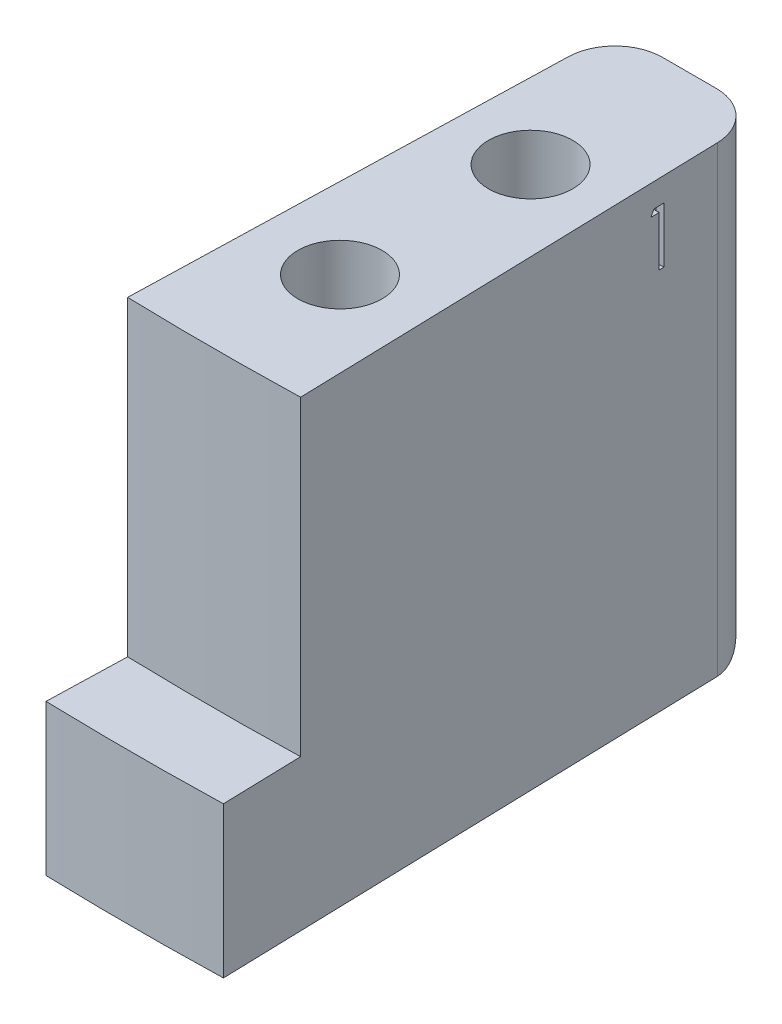
ISO-10303-21;
HEADER;
FILE_DESCRIPTION(('STEP AP214'),'2;1');
FILE_NAME('part.step','',(''),(''),'','','');
FILE_SCHEMA(('AUTOMOTIVE_DESIGN { 1 0 10303 214 1 1 1 1 }'));
ENDSEC;
DATA;
#1=APPLICATION_CONTEXT('core data for automotive mechanical design processes');
#2=APPLICATION_PROTOCOL_DEFINITION('international standard','automotive_design',2000,#1);
#3=PRODUCT_CONTEXT('',#1,'mechanical');
#4=PRODUCT('Part','Part','',(#3));
#5=PRODUCT_RELATED_PRODUCT_CATEGORY('part','',(#4));
#6=PRODUCT_DEFINITION_FORMATION('','',#4);
#7=PRODUCT_DEFINITION_CONTEXT('part definition',#1,'design');
#8=PRODUCT_DEFINITION('design','',#6,#7);
#9=PRODUCT_DEFINITION_SHAPE('','',#8);
#10=(LENGTH_UNIT() NAMED_UNIT(*) SI_UNIT(.MILLI.,.METRE.));
#11=(NAMED_UNIT(*) PLANE_ANGLE_UNIT() SI_UNIT($,.RADIAN.));
#12=(NAMED_UNIT(*) SI_UNIT($,.STERADIAN.) SOLID_ANGLE_UNIT());
#13=UNCERTAINTY_MEASURE_WITH_UNIT(LENGTH_MEASURE(1.E-05),#10,'distance_accuracy_value','');
#14=(GEOMETRIC_REPRESENTATION_CONTEXT(3) GLOBAL_UNCERTAINTY_ASSIGNED_CONTEXT((#13)) GLOBAL_UNIT_ASSIGNED_CONTEXT((#10,
#11,#12)) REPRESENTATION_CONTEXT('',''));
#15=CARTESIAN_POINT('',(0.,0.,0.));
#16=DIRECTION('',(0.,0.,1.));
#17=DIRECTION('',(1.,0.,0.));
#18=AXIS2_PLACEMENT_3D('',#15,#16,#17);
#19=CARTESIAN_POINT('',(0.,29.1,0.));
#20=DIRECTION('',(0.999610115040354,0.,-0.0279216387235691));
#21=DIRECTION('',(-0.0279216387235691,0.,-0.999610115040354));
#22=AXIS2_PLACEMENT_3D('',#19,#20,#21);
#23=PLANE('',#22);
#24=CARTESIAN_POINT('',(4.69266490502674,3.,168.));
#25=DIRECTION('',(0.999610115040354,0.,-0.0279216387235691));
#26=DIRECTION('',(-0.0279216387235691,0.,-0.999610115040354));
#27=AXIS2_PLACEMENT_3D('',#24,#25,#26);
#28=ELLIPSE('',#27,3.00117011108765,3.);
#29=CARTESIAN_POINT('',(4.69266490502674,0.,168.));
#30=VERTEX_POINT('',#29);
#31=CARTESIAN_POINT('',(4.69032513906015,0.00116965487893805,167.916235083829));
#32=VERTEX_POINT('',#31);
#33=EDGE_CURVE('E400',#30,#32,#28,.T.);
#34=ORIENTED_EDGE('',*,*,#33,.T.);
#35=DIRECTION('',(0.,-1.,0.));
#36=VECTOR('',#35,1.);
#37=CARTESIAN_POINT('',(4.69032513906015,29.1,167.916235083829));
#38=LINE('',#37,#36);
#39=CARTESIAN_POINT('',(4.69032513906015,29.1,167.916235083829));
#40=VERTEX_POINT('',#39);
#41=EDGE_CURVE('E46',#32,#40,#38,.F.);
#42=ORIENTED_EDGE('',*,*,#41,.T.);
#43=DIRECTION('',(0.0279216387235691,0.,0.999610115040354));
#44=VECTOR('',#43,1.);
#45=CARTESIAN_POINT('',(0.,29.1,0.));
#46=LINE('',#45,#44);
#47=CARTESIAN_POINT('',(5.44471955109597,29.1,194.923972432869));
#48=VERTEX_POINT('',#47);
#49=EDGE_CURVE('E373',#40,#48,#46,.T.);
#50=ORIENTED_EDGE('',*,*,#49,.T.);
#51=DIRECTION('',(0.,-1.,0.));
#52=VECTOR('',#51,1.);
#53=CARTESIAN_POINT('',(5.44471955109597,29.1,194.923972432869));
#54=LINE('',#53,#52);
#55=CARTESIAN_POINT('',(5.44471955109597,9.5,194.923972432869));
#56=VERTEX_POINT('',#55);
#57=EDGE_CURVE('E378',#48,#56,#54,.T.);
#58=ORIENTED_EDGE('',*,*,#57,.T.);
#59=DIRECTION('',(0.0279216387235691,0.,0.999610115040354));
#60=VECTOR('',#59,1.);
#61=CARTESIAN_POINT('',(0.,9.5,0.));
#62=LINE('',#61,#60);
#63=CARTESIAN_POINT('',(5.58432774471382,9.5,199.922023008071));
#64=VERTEX_POINT('',#63);
#65=EDGE_CURVE('E352',#56,#64,#62,.T.);
#66=ORIENTED_EDGE('',*,*,#65,.T.);
#67=DIRECTION('',(0.,-1.,0.));
#68=VECTOR('',#67,1.);
#69=CARTESIAN_POINT('',(5.58432774471382,9.5,199.922023008071));
#70=LINE('',#69,#68);
#71=CARTESIAN_POINT('',(5.58432774471382,0.,199.922023008071));
#72=VERTEX_POINT('',#71);
#73=EDGE_CURVE('E357',#64,#72,#70,.T.);
#74=ORIENTED_EDGE('',*,*,#73,.T.);
#75=DIRECTION('',(0.0279216387235691,0.,0.999610115040354));
#76=VECTOR('',#75,1.);
#77=CARTESIAN_POINT('',(0.,0.,0.));
#78=LINE('',#77,#76);
#79=EDGE_CURVE('E370',#30,#72,#78,.T.);
#80=ORIENTED_EDGE('',*,*,#79,.F.);
#81=EDGE_LOOP('',(#34,#42,#50,#58,#66,#74,#80));
#82=FACE_BOUND('',#81,.T.);
#83=DIRECTION('',(0.0279216387235691,0.,0.999610115040354));
#84=VECTOR('',#83,1.);
#85=CARTESIAN_POINT('',(4.79610519345521,27.2410256410256,171.703219558117));
#86=LINE('',#85,#84);
#87=CARTESIAN_POINT('',(4.79610519345521,27.2410256410256,171.703219558117));
#88=VERTEX_POINT('',#87);
#89=CARTESIAN_POINT('',(4.81113992199867,27.2410256410256,172.241471158523));
#90=VERTEX_POINT('',#89);
#91=EDGE_CURVE('E233',#88,#90,#86,.T.);
#92=ORIENTED_EDGE('',*,*,#91,.T.);
#93=DIRECTION('',(-0.0138683013424019,0.867930013859673,-0.496492861237121));
#94=VECTOR('',#93,1.);
#95=CARTESIAN_POINT('',(4.81113992199867,27.2410256410256,172.241471158523));
#96=LINE('',#95,#94);
#97=CARTESIAN_POINT('',(4.80540401644759,27.6,172.036122566181));
#98=VERTEX_POINT('',#97);
#99=EDGE_CURVE('E54',#90,#98,#96,.T.);
#100=ORIENTED_EDGE('',*,*,#99,.T.);
#101=DIRECTION('',(-0.0279216387235692,0.,-0.999610115040354));
#102=VECTOR('',#101,1.);
#103=CARTESIAN_POINT('',(4.80540401644759,27.6,172.036122566181));
#104=LINE('',#103,#102);
#105=CARTESIAN_POINT('',(4.78733493513819,27.6,171.38923945788));
#106=VERTEX_POINT('',#105);
#107=EDGE_CURVE('E237',#98,#106,#104,.T.);
#108=ORIENTED_EDGE('',*,*,#107,.T.);
#109=DIRECTION('',(0.,-1.,0.));
#110=VECTOR('',#109,1.);
#111=CARTESIAN_POINT('',(4.78733493513819,27.6,171.38923945788));
#112=LINE('',#111,#110);
#113=CARTESIAN_POINT('',(4.78733493513819,24.1,171.38923945788));
#114=VERTEX_POINT('',#113);
#115=EDGE_CURVE('E520',#106,#114,#112,.T.);
#116=ORIENTED_EDGE('',*,*,#115,.T.);
#117=DIRECTION('',(0.0279216387235677,0.,0.999610115040354));
#118=VECTOR('',#117,1.);
#119=CARTESIAN_POINT('',(4.78733493513819,24.1,171.38923945788));
#120=LINE('',#119,#118);
#121=CARTESIAN_POINT('',(4.79610519345521,24.1,171.703219558117));
#122=VERTEX_POINT('',#121);
#123=EDGE_CURVE('E505',#114,#122,#120,.T.);
#124=ORIENTED_EDGE('',*,*,#123,.T.);
#125=DIRECTION('',(0.,1.,0.));
#126=VECTOR('',#125,1.);
#127=CARTESIAN_POINT('',(4.79610519345521,24.1,171.703219558117));
#128=LINE('',#127,#126);
#129=EDGE_CURVE('E501',#122,#88,#128,.T.);
#130=ORIENTED_EDGE('',*,*,#129,.T.);
#131=EDGE_LOOP('',(#92,#100,#108,#116,#124,#130));
#132=FACE_BOUND('',#131,.T.);
#133=ADVANCED_FACE('F37',(#82,#132),#23,.T.);
#134=CARTESIAN_POINT('',(0.,29.1,175.));
#135=DIRECTION('',(0.,1.,0.));
#136=DIRECTION('',(0.,0.,1.));
#137=AXIS2_PLACEMENT_3D('',#134,#135,#136);
#138=CYLINDRICAL_SURFACE('',#137,2.65);
#139=CARTESIAN_POINT('',(0.,29.1,175.));
#140=DIRECTION('',(0.,1.,0.));
#141=DIRECTION('',(0.,0.,1.));
#142=AXIS2_PLACEMENT_3D('',#139,#140,#141);
#143=CIRCLE('',#142,2.65);
#144=CARTESIAN_POINT('',(0.,29.1,177.65));
#145=VERTEX_POINT('',#144);
#146=EDGE_CURVE('E342',#145,#145,#143,.T.);
#147=ORIENTED_EDGE('',*,*,#146,.T.);
#148=EDGE_LOOP('',(#147));
#149=FACE_BOUND('',#148,.T.);
#150=CARTESIAN_POINT('',(0.,5.,175.));
#151=DIRECTION('',(0.,-1.,0.));
#152=DIRECTION('',(0.,0.,-1.));
#153=AXIS2_PLACEMENT_3D('',#150,#151,#152);
#154=CIRCLE('',#153,2.65);
#155=CARTESIAN_POINT('',(0.,5.,172.35));
#156=VERTEX_POINT('',#155);
#157=EDGE_CURVE('E41',#156,#156,#154,.F.);
#158=ORIENTED_EDGE('',*,*,#157,.F.);
#159=EDGE_LOOP('',(#158));
#160=FACE_BOUND('',#159,.T.);
#161=ADVANCED_FACE('F413',(#149,#160),#138,.F.);
#162=CARTESIAN_POINT('',(0.,29.1,187.));
#163=DIRECTION('',(0.,1.,0.));
#164=DIRECTION('',(0.,0.,1.));
#165=AXIS2_PLACEMENT_3D('',#162,#163,#164);
#166=CYLINDRICAL_SURFACE('',#165,2.65);
#167=CARTESIAN_POINT('',(0.,29.1,187.));
#168=DIRECTION('',(0.,1.,0.));
#169=DIRECTION('',(0.,0.,1.));
#170=AXIS2_PLACEMENT_3D('',#167,#168,#169);
#171=CIRCLE('',#170,2.65);
#172=CARTESIAN_POINT('',(0.,29.1,189.65));
#173=VERTEX_POINT('',#172);
#174=EDGE_CURVE('E339',#173,#173,#171,.T.);
#175=ORIENTED_EDGE('',*,*,#174,.T.);
#176=EDGE_LOOP('',(#175));
#177=FACE_BOUND('',#176,.T.);
#178=CARTESIAN_POINT('',(0.,5.,187.));
#179=DIRECTION('',(0.,-1.,0.));
#180=DIRECTION('',(0.,0.,-1.));
#181=AXIS2_PLACEMENT_3D('',#178,#179,#180);
#182=CIRCLE('',#181,2.65);
#183=CARTESIAN_POINT('',(0.,5.,184.35));
#184=VERTEX_POINT('',#183);
#185=EDGE_CURVE('E285',#184,#184,#182,.F.);
#186=ORIENTED_EDGE('',*,*,#185,.F.);
#187=EDGE_LOOP('',(#186));
#188=FACE_BOUND('',#187,.T.);
#189=ADVANCED_FACE('F415',(#177,#188),#166,.F.);
#190=CARTESIAN_POINT('',(0.,29.1,0.));
#191=DIRECTION('',(0.999610115040354,0.,0.0279216387235689));
#192=DIRECTION('',(0.0279216387235689,0.,-0.999610115040354));
#193=AXIS2_PLACEMENT_3D('',#190,#191,#192);
#194=PLANE('',#193);
#195=DIRECTION('',(-0.0279216387235689,0.,0.999610115040354));
#196=VECTOR('',#195,1.);
#197=CARTESIAN_POINT('',(0.,29.1,0.));
#198=LINE('',#197,#196);
#199=CARTESIAN_POINT('',(-4.69032513906011,29.1,167.916235083829));
#200=VERTEX_POINT('',#199);
#201=CARTESIAN_POINT('',(-5.44471955109592,29.1,194.923972432869));
#202=VERTEX_POINT('',#201);
#203=EDGE_CURVE('E367',#200,#202,#198,.T.);
#204=ORIENTED_EDGE('',*,*,#203,.F.);
#205=DIRECTION('',(0.,-1.,0.));
#206=VECTOR('',#205,1.);
#207=CARTESIAN_POINT('',(-4.69032513906011,0.,167.916235083829));
#208=LINE('',#207,#206);
#209=CARTESIAN_POINT('',(-4.69032513906011,0.00116965487893708,167.916235083829));
#210=VERTEX_POINT('',#209);
#211=EDGE_CURVE('E387',#200,#210,#208,.T.);
#212=ORIENTED_EDGE('',*,*,#211,.T.);
#213=CARTESIAN_POINT('',(-4.6926649050267,3.,168.));
#214=DIRECTION('',(0.999610115040354,0.,0.0279216387235689));
#215=DIRECTION('',(-0.0279216387235689,0.,0.999610115040354));
#216=AXIS2_PLACEMENT_3D('',#213,#214,#215);
#217=ELLIPSE('',#216,3.00117011108765,3.);
#218=CARTESIAN_POINT('',(-4.69266490502669,0.,168.));
#219=VERTEX_POINT('',#218);
#220=EDGE_CURVE('E385',#210,#219,#217,.F.);
#221=ORIENTED_EDGE('',*,*,#220,.T.);
#222=DIRECTION('',(-0.0279216387235689,0.,0.999610115040354));
#223=VECTOR('',#222,1.);
#224=CARTESIAN_POINT('',(0.,0.,0.));
#225=LINE('',#224,#223);
#226=CARTESIAN_POINT('',(-5.58432774471377,0.,199.922023008071));
#227=VERTEX_POINT('',#226);
#228=EDGE_CURVE('E366',#219,#227,#225,.T.);
#229=ORIENTED_EDGE('',*,*,#228,.T.);
#230=DIRECTION('',(0.,-1.,0.));
#231=VECTOR('',#230,1.);
#232=CARTESIAN_POINT('',(-5.58432774471377,9.5,199.922023008071));
#233=LINE('',#232,#231);
#234=CARTESIAN_POINT('',(-5.58432774471377,9.5,199.922023008071));
#235=VERTEX_POINT('',#234);
#236=EDGE_CURVE('E363',#235,#227,#233,.T.);
#237=ORIENTED_EDGE('',*,*,#236,.F.);
#238=DIRECTION('',(-0.0279216387235689,0.,0.999610115040354));
#239=VECTOR('',#238,1.);
#240=CARTESIAN_POINT('',(0.,9.5,0.));
#241=LINE('',#240,#239);
#242=CARTESIAN_POINT('',(-5.44471955109592,9.5,194.923972432869));
#243=VERTEX_POINT('',#242);
#244=EDGE_CURVE('E346',#243,#235,#241,.T.);
#245=ORIENTED_EDGE('',*,*,#244,.F.);
#246=DIRECTION('',(0.,-1.,0.));
#247=VECTOR('',#246,1.);
#248=CARTESIAN_POINT('',(-5.44471955109592,29.1,194.923972432869));
#249=LINE('',#248,#247);
#250=EDGE_CURVE('E383',#202,#243,#249,.T.);
#251=ORIENTED_EDGE('',*,*,#250,.F.);
#252=EDGE_LOOP('',(#204,#212,#221,#229,#237,#245,#251));
#253=FACE_BOUND('',#252,.T.);
#254=ADVANCED_FACE('F422',(#253),#194,.F.);
#255=CARTESIAN_POINT('',(0.,29.1,0.));
#256=DIRECTION('',(0.,-1.,0.));
#257=DIRECTION('',(0.,0.,-1.));
#258=AXIS2_PLACEMENT_3D('',#255,#256,#257);
#259=CYLINDRICAL_SURFACE('',#258,195.);
#260=ORIENTED_EDGE('',*,*,#250,.T.);
#261=CARTESIAN_POINT('',(0.,9.5,0.));
#262=DIRECTION('',(0.,1.,0.));
#263=DIRECTION('',(0.,0.,1.));
#264=AXIS2_PLACEMENT_3D('',#261,#262,#263);
#265=CIRCLE('',#264,195.);
#266=EDGE_CURVE('E355',#243,#56,#265,.T.);
#267=ORIENTED_EDGE('',*,*,#266,.T.);
#268=ORIENTED_EDGE('',*,*,#57,.F.);
#269=CARTESIAN_POINT('',(0.,29.1,0.));
#270=DIRECTION('',(0.,1.,0.));
#271=DIRECTION('',(0.,0.,1.));
#272=AXIS2_PLACEMENT_3D('',#269,#270,#271);
#273=CIRCLE('',#272,195.);
#274=EDGE_CURVE('E369',#202,#48,#273,.T.);
#275=ORIENTED_EDGE('',*,*,#274,.F.);
#276=EDGE_LOOP('',(#260,#267,#268,#275));
#277=FACE_BOUND('',#276,.T.);
#278=ADVANCED_FACE('F447',(#277),#259,.T.);
#279=CARTESIAN_POINT('',(0.,29.1,165.));
#280=DIRECTION('',(0.,0.,-1.));
#281=DIRECTION('',(-1.,0.,0.));
#282=AXIS2_PLACEMENT_3D('',#279,#280,#281);
#283=PLANE('',#282);
#284=DIRECTION('',(1.,0.,0.));
#285=VECTOR('',#284,1.);
#286=CARTESIAN_POINT('',(-4.60886731743693,3.,165.));
#287=LINE('',#286,#285);
#288=CARTESIAN_POINT('',(1.69149479393909,3.,165.));
#289=VERTEX_POINT('',#288);
#290=CARTESIAN_POINT('',(-1.69149479393904,3.,165.));
#291=VERTEX_POINT('',#290);
#292=EDGE_CURVE('E390',#289,#291,#287,.F.);
#293=ORIENTED_EDGE('',*,*,#292,.T.);
#294=DIRECTION('',(0.,-1.,0.));
#295=VECTOR('',#294,1.);
#296=CARTESIAN_POINT('',(-1.69149479393904,29.1,165.));
#297=LINE('',#296,#295);
#298=CARTESIAN_POINT('',(-1.69149479393904,29.1,165.));
#299=VERTEX_POINT('',#298);
#300=EDGE_CURVE('E394',#291,#299,#297,.F.);
#301=ORIENTED_EDGE('',*,*,#300,.T.);
#302=DIRECTION('',(1.,0.,0.));
#303=VECTOR('',#302,1.);
#304=CARTESIAN_POINT('',(0.,29.1,165.));
#305=LINE('',#304,#303);
#306=CARTESIAN_POINT('',(1.69149479393909,29.1,165.));
#307=VERTEX_POINT('',#306);
#308=EDGE_CURVE('E375',#299,#307,#305,.T.);
#309=ORIENTED_EDGE('',*,*,#308,.T.);
#310=DIRECTION('',(0.,-1.,0.));
#311=VECTOR('',#310,1.);
#312=CARTESIAN_POINT('',(1.69149479393909,29.1,165.));
#313=LINE('',#312,#311);
#314=EDGE_CURVE('E392',#307,#289,#313,.T.);
#315=ORIENTED_EDGE('',*,*,#314,.T.);
#316=EDGE_LOOP('',(#293,#301,#309,#315));
#317=FACE_BOUND('',#316,.T.);
#318=ADVANCED_FACE('F441',(#317),#283,.T.);
#319=CARTESIAN_POINT('',(0.,29.1,0.));
#320=DIRECTION('',(0.,1.,0.));
#321=DIRECTION('',(0.,0.,1.));
#322=AXIS2_PLACEMENT_3D('',#319,#320,#321);
#323=PLANE('',#322);
#324=ORIENTED_EDGE('',*,*,#174,.F.);
#325=EDGE_LOOP('',(#324));
#326=FACE_BOUND('',#325,.T.);
#327=ORIENTED_EDGE('',*,*,#146,.F.);
#328=EDGE_LOOP('',(#327));
#329=FACE_BOUND('',#328,.T.);
#330=ORIENTED_EDGE('',*,*,#308,.F.);
#331=CARTESIAN_POINT('',(-1.69149479393904,29.1,168.));
#332=DIRECTION('',(0.,1.,0.));
#333=DIRECTION('',(0.,0.,1.));
#334=AXIS2_PLACEMENT_3D('',#331,#332,#333);
#335=CIRCLE('',#334,3.);
#336=EDGE_CURVE('E398',#299,#200,#335,.T.);
#337=ORIENTED_EDGE('',*,*,#336,.T.);
#338=ORIENTED_EDGE('',*,*,#203,.T.);
#339=ORIENTED_EDGE('',*,*,#274,.T.);
#340=ORIENTED_EDGE('',*,*,#49,.F.);
#341=CARTESIAN_POINT('',(1.69149479393909,29.1,168.));
#342=DIRECTION('',(0.,1.,0.));
#343=DIRECTION('',(0.,0.,1.));
#344=AXIS2_PLACEMENT_3D('',#341,#342,#343);
#345=CIRCLE('',#344,3.);
#346=EDGE_CURVE('E396',#40,#307,#345,.T.);
#347=ORIENTED_EDGE('',*,*,#346,.T.);
#348=EDGE_LOOP('',(#330,#337,#338,#339,#340,#347));
#349=FACE_BOUND('',#348,.T.);
#350=ADVANCED_FACE('F438',(#326,#329,#349),#323,.T.);
#351=CARTESIAN_POINT('',(0.,0.,0.));
#352=DIRECTION('',(0.,1.,0.));
#353=DIRECTION('',(0.,0.,1.));
#354=AXIS2_PLACEMENT_3D('',#351,#352,#353);
#355=PLANE('',#354);
#356=DIRECTION('',(-0.866025403784437,0.,-0.500000000000004));
#357=VECTOR('',#356,1.);
#358=CARTESIAN_POINT('',(0.,0.,179.618802153517));
#359=LINE('',#358,#357);
#360=CARTESIAN_POINT('',(0.,0.,179.618802153517));
#361=VERTEX_POINT('',#360);
#362=CARTESIAN_POINT('',(-4.,0.,177.309401076758));
#363=VERTEX_POINT('',#362);
#364=EDGE_CURVE('E268',#361,#363,#359,.T.);
#365=ORIENTED_EDGE('',*,*,#364,.F.);
#366=DIRECTION('',(-0.866025403784437,0.,0.500000000000003));
#367=VECTOR('',#366,1.);
#368=CARTESIAN_POINT('',(3.99999999999998,0.,177.309401076758));
#369=LINE('',#368,#367);
#370=CARTESIAN_POINT('',(3.99999999999998,0.,177.309401076758));
#371=VERTEX_POINT('',#370);
#372=EDGE_CURVE('E62',#371,#361,#369,.T.);
#373=ORIENTED_EDGE('',*,*,#372,.F.);
#374=DIRECTION('',(0.,0.,1.));
#375=VECTOR('',#374,1.);
#376=CARTESIAN_POINT('',(3.99999999999998,0.,172.690598923241));
#377=LINE('',#376,#375);
#378=CARTESIAN_POINT('',(3.99999999999998,0.,172.690598923241));
#379=VERTEX_POINT('',#378);
#380=EDGE_CURVE('E251',#379,#371,#377,.T.);
#381=ORIENTED_EDGE('',*,*,#380,.F.);
#382=DIRECTION('',(0.866025403784439,0.,0.5));
#383=VECTOR('',#382,1.);
#384=CARTESIAN_POINT('',(0.,0.,170.381197846483));
#385=LINE('',#384,#383);
#386=CARTESIAN_POINT('',(0.,0.,170.381197846483));
#387=VERTEX_POINT('',#386);
#388=EDGE_CURVE('E278',#387,#379,#385,.T.);
#389=ORIENTED_EDGE('',*,*,#388,.F.);
#390=DIRECTION('',(0.866025403784437,0.,-0.500000000000003));
#391=VECTOR('',#390,1.);
#392=CARTESIAN_POINT('',(-4.,0.,172.690598923241));
#393=LINE('',#392,#391);
#394=CARTESIAN_POINT('',(-4.,0.,172.690598923241));
#395=VERTEX_POINT('',#394);
#396=EDGE_CURVE('E275',#395,#387,#393,.T.);
#397=ORIENTED_EDGE('',*,*,#396,.F.);
#398=DIRECTION('',(0.,0.,-1.));
#399=VECTOR('',#398,1.);
#400=CARTESIAN_POINT('',(-4.,0.,177.309401076758));
#401=LINE('',#400,#399);
#402=EDGE_CURVE('E272',#363,#395,#401,.T.);
#403=ORIENTED_EDGE('',*,*,#402,.F.);
#404=EDGE_LOOP('',(#365,#373,#381,#389,#397,#403));
#405=FACE_BOUND('',#404,.T.);
#406=DIRECTION('',(-0.866025403784437,0.,-0.500000000000003));
#407=VECTOR('',#406,1.);
#408=CARTESIAN_POINT('',(0.,0.,191.618802153517));
#409=LINE('',#408,#407);
#410=CARTESIAN_POINT('',(0.,0.,191.618802153517));
#411=VERTEX_POINT('',#410);
#412=CARTESIAN_POINT('',(-4.,0.,189.309401076758));
#413=VERTEX_POINT('',#412);
#414=EDGE_CURVE('E241',#411,#413,#409,.T.);
#415=ORIENTED_EDGE('',*,*,#414,.F.);
#416=DIRECTION('',(-0.866025403784439,0.,0.499999999999999));
#417=VECTOR('',#416,1.);
#418=CARTESIAN_POINT('',(4.00000000000003,0.,189.309401076758));
#419=LINE('',#418,#417);
#420=CARTESIAN_POINT('',(4.00000000000003,0.,189.309401076758));
#421=VERTEX_POINT('',#420);
#422=EDGE_CURVE('E238',#421,#411,#419,.T.);
#423=ORIENTED_EDGE('',*,*,#422,.F.);
#424=DIRECTION('',(0.,0.,1.));
#425=VECTOR('',#424,1.);
#426=CARTESIAN_POINT('',(4.00000000000003,0.,184.690598923241));
#427=LINE('',#426,#425);
#428=CARTESIAN_POINT('',(4.00000000000003,0.,184.690598923241));
#429=VERTEX_POINT('',#428);
#430=EDGE_CURVE('E299',#429,#421,#427,.T.);
#431=ORIENTED_EDGE('',*,*,#430,.F.);
#432=DIRECTION('',(0.86602540378444,0.,0.499999999999998));
#433=VECTOR('',#432,1.);
#434=CARTESIAN_POINT('',(0.,0.,182.381197846483));
#435=LINE('',#434,#433);
#436=CARTESIAN_POINT('',(0.,0.,182.381197846483));
#437=VERTEX_POINT('',#436);
#438=EDGE_CURVE('E323',#437,#429,#435,.T.);
#439=ORIENTED_EDGE('',*,*,#438,.F.);
#440=DIRECTION('',(0.866025403784439,0.,-0.499999999999999));
#441=VECTOR('',#440,1.);
#442=CARTESIAN_POINT('',(-4.,0.,184.690598923241));
#443=LINE('',#442,#441);
#444=CARTESIAN_POINT('',(-4.,0.,184.690598923241));
#445=VERTEX_POINT('',#444);
#446=EDGE_CURVE('E320',#445,#437,#443,.T.);
#447=ORIENTED_EDGE('',*,*,#446,.F.);
#448=DIRECTION('',(0.,0.,-1.));
#449=VECTOR('',#448,1.);
#450=CARTESIAN_POINT('',(-4.,0.,189.309401076758));
#451=LINE('',#450,#449);
#452=EDGE_CURVE('E317',#413,#445,#451,.T.);
#453=ORIENTED_EDGE('',*,*,#452,.F.);
#454=EDGE_LOOP('',(#415,#423,#431,#439,#447,#453));
#455=FACE_BOUND('',#454,.T.);
#456=ORIENTED_EDGE('',*,*,#228,.F.);
#457=DIRECTION('',(1.,0.,0.));
#458=VECTOR('',#457,1.);
#459=CARTESIAN_POINT('',(4.60886731743697,0.,168.));
#460=LINE('',#459,#458);
#461=EDGE_CURVE('E11',#219,#30,#460,.T.);
#462=ORIENTED_EDGE('',*,*,#461,.T.);
#463=ORIENTED_EDGE('',*,*,#79,.T.);
#464=CARTESIAN_POINT('',(0.,0.,0.));
#465=DIRECTION('',(0.,1.,0.));
#466=DIRECTION('',(0.,0.,1.));
#467=AXIS2_PLACEMENT_3D('',#464,#465,#466);
#468=CIRCLE('',#467,200.);
#469=EDGE_CURVE('E350',#227,#72,#468,.T.);
#470=ORIENTED_EDGE('',*,*,#469,.F.);
#471=EDGE_LOOP('',(#456,#462,#463,#470));
#472=FACE_BOUND('',#471,.T.);
#473=ADVANCED_FACE('F436',(#405,#455,#472),#355,.F.);
#474=CARTESIAN_POINT('',(0.,9.5,0.));
#475=DIRECTION('',(0.,-1.,0.));
#476=DIRECTION('',(0.,0.,-1.));
#477=AXIS2_PLACEMENT_3D('',#474,#475,#476);
#478=CYLINDRICAL_SURFACE('',#477,200.);
#479=ORIENTED_EDGE('',*,*,#469,.T.);
#480=ORIENTED_EDGE('',*,*,#73,.F.);
#481=CARTESIAN_POINT('',(0.,9.5,0.));
#482=DIRECTION('',(0.,1.,0.));
#483=DIRECTION('',(0.,0.,1.));
#484=AXIS2_PLACEMENT_3D('',#481,#482,#483);
#485=CIRCLE('',#484,200.);
#486=EDGE_CURVE('E349',#235,#64,#485,.T.);
#487=ORIENTED_EDGE('',*,*,#486,.F.);
#488=ORIENTED_EDGE('',*,*,#236,.T.);
#489=EDGE_LOOP('',(#479,#480,#487,#488));
#490=FACE_BOUND('',#489,.T.);
#491=ADVANCED_FACE('F432',(#490),#478,.T.);
#492=CARTESIAN_POINT('',(0.,9.5,0.));
#493=DIRECTION('',(0.,1.,0.));
#494=DIRECTION('',(0.,0.,1.));
#495=AXIS2_PLACEMENT_3D('',#492,#493,#494);
#496=PLANE('',#495);
#497=ORIENTED_EDGE('',*,*,#244,.T.);
#498=ORIENTED_EDGE('',*,*,#486,.T.);
#499=ORIENTED_EDGE('',*,*,#65,.F.);
#500=ORIENTED_EDGE('',*,*,#266,.F.);
#501=EDGE_LOOP('',(#497,#498,#499,#500));
#502=FACE_BOUND('',#501,.T.);
#503=ADVANCED_FACE('F429',(#502),#496,.T.);
#504=CARTESIAN_POINT('',(1.69149479393909,29.1,168.));
#505=DIRECTION('',(0.,-1.,0.));
#506=DIRECTION('',(0.,0.,-1.));
#507=AXIS2_PLACEMENT_3D('',#504,#505,#506);
#508=CYLINDRICAL_SURFACE('',#507,3.);
#509=ORIENTED_EDGE('',*,*,#346,.F.);
#510=ORIENTED_EDGE('',*,*,#41,.F.);
#511=CARTESIAN_POINT('',(1.69149479393909,3.,168.));
#512=DIRECTION('',(-0.707106781186547,-0.707106781186547,0.));
#513=DIRECTION('',(-0.707106781186547,0.707106781186547,0.));
#514=AXIS2_PLACEMENT_3D('',#511,#512,#513);
#515=ELLIPSE('',#514,4.24264068711928,3.);
#516=EDGE_CURVE('E360',#289,#32,#515,.T.);
#517=ORIENTED_EDGE('',*,*,#516,.F.);
#518=ORIENTED_EDGE('',*,*,#314,.F.);
#519=EDGE_LOOP('',(#509,#510,#517,#518));
#520=FACE_BOUND('',#519,.T.);
#521=ADVANCED_FACE('F39',(#520),#508,.T.);
#522=CARTESIAN_POINT('',(0.,3.,168.));
#523=DIRECTION('',(-1.,0.,0.));
#524=DIRECTION('',(0.,0.,1.));
#525=AXIS2_PLACEMENT_3D('',#522,#523,#524);
#526=CYLINDRICAL_SURFACE('',#525,3.);
#527=ORIENTED_EDGE('',*,*,#461,.F.);
#528=ORIENTED_EDGE('',*,*,#220,.F.);
#529=CARTESIAN_POINT('',(-1.69149479393904,3.,168.));
#530=DIRECTION('',(-0.707106781186547,0.707106781186547,0.));
#531=DIRECTION('',(-0.707106781186547,-0.707106781186547,0.));
#532=AXIS2_PLACEMENT_3D('',#529,#530,#531);
#533=ELLIPSE('',#532,4.24264068711928,3.);
#534=EDGE_CURVE('E345',#291,#210,#533,.T.);
#535=ORIENTED_EDGE('',*,*,#534,.F.);
#536=ORIENTED_EDGE('',*,*,#292,.F.);
#537=ORIENTED_EDGE('',*,*,#516,.T.);
#538=ORIENTED_EDGE('',*,*,#33,.F.);
#539=EDGE_LOOP('',(#527,#528,#535,#536,#537,#538));
#540=FACE_BOUND('',#539,.T.);
#541=ADVANCED_FACE('F459',(#540),#526,.T.);
#542=CARTESIAN_POINT('',(-1.69149479393904,29.1,168.));
#543=DIRECTION('',(0.,1.,0.));
#544=DIRECTION('',(0.,0.,1.));
#545=AXIS2_PLACEMENT_3D('',#542,#543,#544);
#546=CYLINDRICAL_SURFACE('',#545,3.);
#547=ORIENTED_EDGE('',*,*,#336,.F.);
#548=ORIENTED_EDGE('',*,*,#300,.F.);
#549=ORIENTED_EDGE('',*,*,#534,.T.);
#550=ORIENTED_EDGE('',*,*,#211,.F.);
#551=EDGE_LOOP('',(#547,#548,#549,#550));
#552=FACE_BOUND('',#551,.T.);
#553=ADVANCED_FACE('F456',(#552),#546,.T.);
#554=CARTESIAN_POINT('',(0.,5.,0.));
#555=DIRECTION('',(0.,-1.,0.));
#556=DIRECTION('',(0.,0.,-1.));
#557=AXIS2_PLACEMENT_3D('',#554,#555,#556);
#558=PLANE('',#557);
#559=DIRECTION('',(-0.866025403784439,0.,0.499999999999999));
#560=VECTOR('',#559,1.);
#561=CARTESIAN_POINT('',(4.00000000000003,5.,189.309401076758));
#562=LINE('',#561,#560);
#563=CARTESIAN_POINT('',(4.00000000000003,5.,189.309401076758));
#564=VERTEX_POINT('',#563);
#565=CARTESIAN_POINT('',(0.,5.,191.618802153517));
#566=VERTEX_POINT('',#565);
#567=EDGE_CURVE('E295',#564,#566,#562,.T.);
#568=ORIENTED_EDGE('',*,*,#567,.T.);
#569=DIRECTION('',(-0.866025403784437,0.,-0.500000000000003));
#570=VECTOR('',#569,1.);
#571=CARTESIAN_POINT('',(0.,5.,191.618802153517));
#572=LINE('',#571,#570);
#573=CARTESIAN_POINT('',(-4.,5.,189.309401076758));
#574=VERTEX_POINT('',#573);
#575=EDGE_CURVE('E298',#566,#574,#572,.T.);
#576=ORIENTED_EDGE('',*,*,#575,.T.);
#577=DIRECTION('',(0.,0.,-1.));
#578=VECTOR('',#577,1.);
#579=CARTESIAN_POINT('',(-4.,5.,189.309401076758));
#580=LINE('',#579,#578);
#581=CARTESIAN_POINT('',(-4.,5.,184.690598923241));
#582=VERTEX_POINT('',#581);
#583=EDGE_CURVE('E302',#574,#582,#580,.T.);
#584=ORIENTED_EDGE('',*,*,#583,.T.);
#585=DIRECTION('',(0.866025403784439,0.,-0.499999999999999));
#586=VECTOR('',#585,1.);
#587=CARTESIAN_POINT('',(-4.,5.,184.690598923241));
#588=LINE('',#587,#586);
#589=CARTESIAN_POINT('',(0.,5.,182.381197846483));
#590=VERTEX_POINT('',#589);
#591=EDGE_CURVE('E305',#582,#590,#588,.T.);
#592=ORIENTED_EDGE('',*,*,#591,.T.);
#593=DIRECTION('',(0.86602540378444,0.,0.499999999999998));
#594=VECTOR('',#593,1.);
#595=CARTESIAN_POINT('',(0.,5.,182.381197846483));
#596=LINE('',#595,#594);
#597=CARTESIAN_POINT('',(4.00000000000003,5.,184.690598923241));
#598=VERTEX_POINT('',#597);
#599=EDGE_CURVE('E308',#590,#598,#596,.T.);
#600=ORIENTED_EDGE('',*,*,#599,.T.);
#601=DIRECTION('',(0.,0.,1.));
#602=VECTOR('',#601,1.);
#603=CARTESIAN_POINT('',(4.00000000000003,5.,184.690598923241));
#604=LINE('',#603,#602);
#605=EDGE_CURVE('E311',#598,#564,#604,.T.);
#606=ORIENTED_EDGE('',*,*,#605,.T.);
#607=EDGE_LOOP('',(#568,#576,#584,#592,#600,#606));
#608=FACE_BOUND('',#607,.T.);
#609=ORIENTED_EDGE('',*,*,#185,.T.);
#610=EDGE_LOOP('',(#609));
#611=FACE_BOUND('',#610,.T.);
#612=ADVANCED_FACE('F458',(#608,#611),#558,.T.);
#613=CARTESIAN_POINT('',(4.00000000000003,5.,189.309401076758));
#614=DIRECTION('',(0.499999999999999,0.,0.866025403784439));
#615=DIRECTION('',(0.866025403784439,0.,-0.499999999999999));
#616=AXIS2_PLACEMENT_3D('',#613,#614,#615);
#617=PLANE('',#616);
#618=ORIENTED_EDGE('',*,*,#422,.T.);
#619=DIRECTION('',(0.,-1.,0.));
#620=VECTOR('',#619,1.);
#621=CARTESIAN_POINT('',(0.,5.,191.618802153517));
#622=LINE('',#621,#620);
#623=EDGE_CURVE('E313',#566,#411,#622,.T.);
#624=ORIENTED_EDGE('',*,*,#623,.F.);
#625=ORIENTED_EDGE('',*,*,#567,.F.);
#626=DIRECTION('',(0.,-1.,0.));
#627=VECTOR('',#626,1.);
#628=CARTESIAN_POINT('',(4.00000000000003,5.,189.309401076758));
#629=LINE('',#628,#627);
#630=EDGE_CURVE('E269',#564,#421,#629,.T.);
#631=ORIENTED_EDGE('',*,*,#630,.T.);
#632=EDGE_LOOP('',(#618,#624,#625,#631));
#633=FACE_BOUND('',#632,.T.);
#634=ADVANCED_FACE('F583',(#633),#617,.F.);
#635=CARTESIAN_POINT('',(4.00000000000003,5.,184.690598923241));
#636=DIRECTION('',(1.,0.,0.));
#637=DIRECTION('',(0.,0.,-1.));
#638=AXIS2_PLACEMENT_3D('',#635,#636,#637);
#639=PLANE('',#638);
#640=ORIENTED_EDGE('',*,*,#430,.T.);
#641=ORIENTED_EDGE('',*,*,#630,.F.);
#642=ORIENTED_EDGE('',*,*,#605,.F.);
#643=DIRECTION('',(0.,-1.,0.));
#644=VECTOR('',#643,1.);
#645=CARTESIAN_POINT('',(4.00000000000003,5.,184.690598923241));
#646=LINE('',#645,#644);
#647=EDGE_CURVE('E329',#598,#429,#646,.T.);
#648=ORIENTED_EDGE('',*,*,#647,.T.);
#649=EDGE_LOOP('',(#640,#641,#642,#648));
#650=FACE_BOUND('',#649,.T.);
#651=ADVANCED_FACE('F585',(#650),#639,.F.);
#652=CARTESIAN_POINT('',(0.,5.,182.381197846483));
#653=DIRECTION('',(0.499999999999998,0.,-0.86602540378444));
#654=DIRECTION('',(-0.86602540378444,0.,-0.499999999999998));
#655=AXIS2_PLACEMENT_3D('',#652,#653,#654);
#656=PLANE('',#655);
#657=ORIENTED_EDGE('',*,*,#438,.T.);
#658=ORIENTED_EDGE('',*,*,#647,.F.);
#659=ORIENTED_EDGE('',*,*,#599,.F.);
#660=DIRECTION('',(0.,-1.,0.));
#661=VECTOR('',#660,1.);
#662=CARTESIAN_POINT('',(0.,5.,182.381197846483));
#663=LINE('',#662,#661);
#664=EDGE_CURVE('E331',#590,#437,#663,.T.);
#665=ORIENTED_EDGE('',*,*,#664,.T.);
#666=EDGE_LOOP('',(#657,#658,#659,#665));
#667=FACE_BOUND('',#666,.T.);
#668=ADVANCED_FACE('F588',(#667),#656,.F.);
#669=CARTESIAN_POINT('',(-4.,5.,184.690598923241));
#670=DIRECTION('',(-0.5,0.,-0.866025403784439));
#671=DIRECTION('',(-0.866025403784439,0.,0.5));
#672=AXIS2_PLACEMENT_3D('',#669,#670,#671);
#673=PLANE('',#672);
#674=ORIENTED_EDGE('',*,*,#446,.T.);
#675=ORIENTED_EDGE('',*,*,#664,.F.);
#676=ORIENTED_EDGE('',*,*,#591,.F.);
#677=DIRECTION('',(0.,-1.,0.));
#678=VECTOR('',#677,1.);
#679=CARTESIAN_POINT('',(-4.,5.,184.690598923241));
#680=LINE('',#679,#678);
#681=EDGE_CURVE('E333',#582,#445,#680,.T.);
#682=ORIENTED_EDGE('',*,*,#681,.T.);
#683=EDGE_LOOP('',(#674,#675,#676,#682));
#684=FACE_BOUND('',#683,.T.);
#685=ADVANCED_FACE('F592',(#684),#673,.F.);
#686=CARTESIAN_POINT('',(-4.,5.,189.309401076758));
#687=DIRECTION('',(-1.,0.,0.));
#688=DIRECTION('',(0.,0.,1.));
#689=AXIS2_PLACEMENT_3D('',#686,#687,#688);
#690=PLANE('',#689);
#691=ORIENTED_EDGE('',*,*,#452,.T.);
#692=ORIENTED_EDGE('',*,*,#681,.F.);
#693=ORIENTED_EDGE('',*,*,#583,.F.);
#694=DIRECTION('',(0.,-1.,0.));
#695=VECTOR('',#694,1.);
#696=CARTESIAN_POINT('',(-4.,5.,189.309401076758));
#697=LINE('',#696,#695);
#698=EDGE_CURVE('E335',#574,#413,#697,.T.);
#699=ORIENTED_EDGE('',*,*,#698,.T.);
#700=EDGE_LOOP('',(#691,#692,#693,#699));
#701=FACE_BOUND('',#700,.T.);
#702=ADVANCED_FACE('F596',(#701),#690,.F.);
#703=CARTESIAN_POINT('',(0.,5.,191.618802153517));
#704=DIRECTION('',(-0.500000000000003,0.,0.866025403784437));
#705=DIRECTION('',(0.866025403784437,0.,0.500000000000003));
#706=AXIS2_PLACEMENT_3D('',#703,#704,#705);
#707=PLANE('',#706);
#708=ORIENTED_EDGE('',*,*,#414,.T.);
#709=ORIENTED_EDGE('',*,*,#698,.F.);
#710=ORIENTED_EDGE('',*,*,#575,.F.);
#711=ORIENTED_EDGE('',*,*,#623,.T.);
#712=EDGE_LOOP('',(#708,#709,#710,#711));
#713=FACE_BOUND('',#712,.T.);
#714=ADVANCED_FACE('F558',(#713),#707,.F.);
#715=CARTESIAN_POINT('',(0.,5.,0.));
#716=DIRECTION('',(0.,-1.,0.));
#717=DIRECTION('',(0.,0.,-1.));
#718=AXIS2_PLACEMENT_3D('',#715,#716,#717);
#719=PLANE('',#718);
#720=DIRECTION('',(-0.866025403784437,0.,0.500000000000003));
#721=VECTOR('',#720,1.);
#722=CARTESIAN_POINT('',(3.99999999999998,5.,177.309401076758));
#723=LINE('',#722,#721);
#724=CARTESIAN_POINT('',(3.99999999999998,5.,177.309401076758));
#725=VERTEX_POINT('',#724);
#726=CARTESIAN_POINT('',(0.,5.,179.618802153517));
#727=VERTEX_POINT('',#726);
#728=EDGE_CURVE('E247',#725,#727,#723,.T.);
#729=ORIENTED_EDGE('',*,*,#728,.T.);
#730=DIRECTION('',(-0.866025403784437,0.,-0.500000000000004));
#731=VECTOR('',#730,1.);
#732=CARTESIAN_POINT('',(0.,5.,179.618802153517));
#733=LINE('',#732,#731);
#734=CARTESIAN_POINT('',(-4.,5.,177.309401076758));
#735=VERTEX_POINT('',#734);
#736=EDGE_CURVE('E250',#727,#735,#733,.T.);
#737=ORIENTED_EDGE('',*,*,#736,.T.);
#738=DIRECTION('',(0.,0.,-1.));
#739=VECTOR('',#738,1.);
#740=CARTESIAN_POINT('',(-4.,5.,177.309401076758));
#741=LINE('',#740,#739);
#742=CARTESIAN_POINT('',(-4.,5.,172.690598923241));
#743=VERTEX_POINT('',#742);
#744=EDGE_CURVE('E254',#735,#743,#741,.T.);
#745=ORIENTED_EDGE('',*,*,#744,.T.);
#746=DIRECTION('',(0.866025403784437,0.,-0.500000000000003));
#747=VECTOR('',#746,1.);
#748=CARTESIAN_POINT('',(-4.,5.,172.690598923241));
#749=LINE('',#748,#747);
#750=CARTESIAN_POINT('',(0.,5.,170.381197846483));
#751=VERTEX_POINT('',#750);
#752=EDGE_CURVE('E257',#743,#751,#749,.T.);
#753=ORIENTED_EDGE('',*,*,#752,.T.);
#754=DIRECTION('',(0.866025403784439,0.,0.5));
#755=VECTOR('',#754,1.);
#756=CARTESIAN_POINT('',(0.,5.,170.381197846483));
#757=LINE('',#756,#755);
#758=CARTESIAN_POINT('',(3.99999999999998,5.,172.690598923241));
#759=VERTEX_POINT('',#758);
#760=EDGE_CURVE('E260',#751,#759,#757,.T.);
#761=ORIENTED_EDGE('',*,*,#760,.T.);
#762=DIRECTION('',(0.,0.,1.));
#763=VECTOR('',#762,1.);
#764=CARTESIAN_POINT('',(3.99999999999998,5.,172.690598923241));
#765=LINE('',#764,#763);
#766=EDGE_CURVE('E263',#759,#725,#765,.T.);
#767=ORIENTED_EDGE('',*,*,#766,.T.);
#768=EDGE_LOOP('',(#729,#737,#745,#753,#761,#767));
#769=FACE_BOUND('',#768,.T.);
#770=ORIENTED_EDGE('',*,*,#157,.T.);
#771=EDGE_LOOP('',(#770));
#772=FACE_BOUND('',#771,.T.);
#773=ADVANCED_FACE('F411',(#769,#772),#719,.T.);
#774=CARTESIAN_POINT('',(3.99999999999998,5.,177.309401076758));
#775=DIRECTION('',(0.500000000000003,0.,0.866025403784437));
#776=DIRECTION('',(0.866025403784437,0.,-0.500000000000003));
#777=AXIS2_PLACEMENT_3D('',#774,#775,#776);
#778=PLANE('',#777);
#779=ORIENTED_EDGE('',*,*,#372,.T.);
#780=DIRECTION('',(0.,-1.,0.));
#781=VECTOR('',#780,1.);
#782=CARTESIAN_POINT('',(0.,5.,179.618802153517));
#783=LINE('',#782,#781);
#784=EDGE_CURVE('E266',#727,#361,#783,.T.);
#785=ORIENTED_EDGE('',*,*,#784,.F.);
#786=ORIENTED_EDGE('',*,*,#728,.F.);
#787=DIRECTION('',(0.,-1.,0.));
#788=VECTOR('',#787,1.);
#789=CARTESIAN_POINT('',(3.99999999999998,5.,177.309401076758));
#790=LINE('',#789,#788);
#791=EDGE_CURVE('E283',#725,#371,#790,.T.);
#792=ORIENTED_EDGE('',*,*,#791,.T.);
#793=EDGE_LOOP('',(#779,#785,#786,#792));
#794=FACE_BOUND('',#793,.T.);
#795=ADVANCED_FACE('F557',(#794),#778,.F.);
#796=CARTESIAN_POINT('',(3.99999999999998,5.,172.690598923241));
#797=DIRECTION('',(1.,0.,0.));
#798=DIRECTION('',(0.,0.,-1.));
#799=AXIS2_PLACEMENT_3D('',#796,#797,#798);
#800=PLANE('',#799);
#801=ORIENTED_EDGE('',*,*,#380,.T.);
#802=ORIENTED_EDGE('',*,*,#791,.F.);
#803=ORIENTED_EDGE('',*,*,#766,.F.);
#804=DIRECTION('',(0.,-1.,0.));
#805=VECTOR('',#804,1.);
#806=CARTESIAN_POINT('',(3.99999999999998,5.,172.690598923241));
#807=LINE('',#806,#805);
#808=EDGE_CURVE('E286',#759,#379,#807,.T.);
#809=ORIENTED_EDGE('',*,*,#808,.T.);
#810=EDGE_LOOP('',(#801,#802,#803,#809));
#811=FACE_BOUND('',#810,.T.);
#812=ADVANCED_FACE('F560',(#811),#800,.F.);
#813=CARTESIAN_POINT('',(0.,5.,170.381197846483));
#814=DIRECTION('',(0.5,0.,-0.866025403784439));
#815=DIRECTION('',(-0.866025403784439,0.,-0.5));
#816=AXIS2_PLACEMENT_3D('',#813,#814,#815);
#817=PLANE('',#816);
#818=ORIENTED_EDGE('',*,*,#388,.T.);
#819=ORIENTED_EDGE('',*,*,#808,.F.);
#820=ORIENTED_EDGE('',*,*,#760,.F.);
#821=DIRECTION('',(0.,-1.,0.));
#822=VECTOR('',#821,1.);
#823=CARTESIAN_POINT('',(0.,5.,170.381197846483));
#824=LINE('',#823,#822);
#825=EDGE_CURVE('E288',#751,#387,#824,.T.);
#826=ORIENTED_EDGE('',*,*,#825,.T.);
#827=EDGE_LOOP('',(#818,#819,#820,#826));
#828=FACE_BOUND('',#827,.T.);
#829=ADVANCED_FACE('F563',(#828),#817,.F.);
#830=CARTESIAN_POINT('',(-4.,5.,172.690598923241));
#831=DIRECTION('',(-0.500000000000003,0.,-0.866025403784437));
#832=DIRECTION('',(-0.866025403784437,0.,0.500000000000003));
#833=AXIS2_PLACEMENT_3D('',#830,#831,#832);
#834=PLANE('',#833);
#835=ORIENTED_EDGE('',*,*,#396,.T.);
#836=ORIENTED_EDGE('',*,*,#825,.F.);
#837=ORIENTED_EDGE('',*,*,#752,.F.);
#838=DIRECTION('',(0.,-1.,0.));
#839=VECTOR('',#838,1.);
#840=CARTESIAN_POINT('',(-4.,5.,172.690598923241));
#841=LINE('',#840,#839);
#842=EDGE_CURVE('E290',#743,#395,#841,.T.);
#843=ORIENTED_EDGE('',*,*,#842,.T.);
#844=EDGE_LOOP('',(#835,#836,#837,#843));
#845=FACE_BOUND('',#844,.T.);
#846=ADVANCED_FACE('F567',(#845),#834,.F.);
#847=CARTESIAN_POINT('',(-4.,5.,177.309401076758));
#848=DIRECTION('',(-1.,0.,0.));
#849=DIRECTION('',(0.,0.,1.));
#850=AXIS2_PLACEMENT_3D('',#847,#848,#849);
#851=PLANE('',#850);
#852=ORIENTED_EDGE('',*,*,#402,.T.);
#853=ORIENTED_EDGE('',*,*,#842,.F.);
#854=ORIENTED_EDGE('',*,*,#744,.F.);
#855=DIRECTION('',(0.,-1.,0.));
#856=VECTOR('',#855,1.);
#857=CARTESIAN_POINT('',(-4.,5.,177.309401076758));
#858=LINE('',#857,#856);
#859=EDGE_CURVE('E292',#735,#363,#858,.T.);
#860=ORIENTED_EDGE('',*,*,#859,.T.);
#861=EDGE_LOOP('',(#852,#853,#854,#860));
#862=FACE_BOUND('',#861,.T.);
#863=ADVANCED_FACE('F571',(#862),#851,.F.);
#864=CARTESIAN_POINT('',(0.,5.,179.618802153517));
#865=DIRECTION('',(-0.500000000000004,0.,0.866025403784437));
#866=DIRECTION('',(0.866025403784437,0.,0.500000000000004));
#867=AXIS2_PLACEMENT_3D('',#864,#865,#866);
#868=PLANE('',#867);
#869=ORIENTED_EDGE('',*,*,#364,.T.);
#870=ORIENTED_EDGE('',*,*,#859,.F.);
#871=ORIENTED_EDGE('',*,*,#736,.F.);
#872=ORIENTED_EDGE('',*,*,#784,.T.);
#873=EDGE_LOOP('',(#869,#870,#871,#872));
#874=FACE_BOUND('',#873,.T.);
#875=ADVANCED_FACE('F554',(#874),#868,.F.);
#876=CARTESIAN_POINT('',(4.31133486447849,27.2410256410256,172.255431977885));
#877=DIRECTION('',(-0.0242340282843321,-0.496686511837746,-0.867591621001245));
#878=DIRECTION('',(0.,0.867846496399712,-0.496832425156355));
#879=AXIS2_PLACEMENT_3D('',#876,#877,#878);
#880=PLANE('',#879);
#881=ORIENTED_EDGE('',*,*,#99,.F.);
#882=DIRECTION('',(0.999610115040354,0.,-0.0279216387235691));
#883=VECTOR('',#882,1.);
#884=CARTESIAN_POINT('',(4.31133486447849,27.2410256410256,172.255431977885));
#885=LINE('',#884,#883);
#886=CARTESIAN_POINT('',(4.31133486447849,27.2410256410256,172.255431977885));
#887=VERTEX_POINT('',#886);
#888=EDGE_CURVE('E232',#887,#90,#885,.T.);
#889=ORIENTED_EDGE('',*,*,#888,.F.);
#890=DIRECTION('',(-0.0138683013424019,0.867930013859673,-0.496492861237121));
#891=VECTOR('',#890,1.);
#892=CARTESIAN_POINT('',(4.31133486447849,27.2410256410256,172.255431977885));
#893=LINE('',#892,#891);
#894=CARTESIAN_POINT('',(4.30559895892741,27.6,172.050083385542));
#895=VERTEX_POINT('',#894);
#896=EDGE_CURVE('E223',#887,#895,#893,.T.);
#897=ORIENTED_EDGE('',*,*,#896,.T.);
#898=DIRECTION('',(0.999610115040354,0.,-0.0279216387235691));
#899=VECTOR('',#898,1.);
#900=CARTESIAN_POINT('',(4.30559895892741,27.6,172.050083385542));
#901=LINE('',#900,#899);
#902=EDGE_CURVE('E231',#895,#98,#901,.T.);
#903=ORIENTED_EDGE('',*,*,#902,.T.);
#904=EDGE_LOOP('',(#881,#889,#897,#903));
#905=FACE_BOUND('',#904,.T.);
#906=ADVANCED_FACE('F230',(#905),#880,.T.);
#907=CARTESIAN_POINT('',(4.30559895892741,27.6,172.050083385542));
#908=DIRECTION('',(0.,-1.,0.));
#909=DIRECTION('',(0.,0.,-1.));
#910=AXIS2_PLACEMENT_3D('',#907,#908,#909);
#911=PLANE('',#910);
#912=ORIENTED_EDGE('',*,*,#107,.F.);
#913=ORIENTED_EDGE('',*,*,#902,.F.);
#914=DIRECTION('',(-0.0279216387235692,0.,-0.999610115040354));
#915=VECTOR('',#914,1.);
#916=CARTESIAN_POINT('',(4.30559895892741,27.6,172.050083385542));
#917=LINE('',#916,#915);
#918=CARTESIAN_POINT('',(4.28752987761801,27.6,171.403200277242));
#919=VERTEX_POINT('',#918);
#920=EDGE_CURVE('E219',#895,#919,#917,.T.);
#921=ORIENTED_EDGE('',*,*,#920,.T.);
#922=DIRECTION('',(0.999610115040354,0.,-0.0279216387235691));
#923=VECTOR('',#922,1.);
#924=CARTESIAN_POINT('',(4.28752987761801,27.6,171.403200277242));
#925=LINE('',#924,#923);
#926=EDGE_CURVE('E239',#919,#106,#925,.T.);
#927=ORIENTED_EDGE('',*,*,#926,.T.);
#928=EDGE_LOOP('',(#912,#913,#921,#927));
#929=FACE_BOUND('',#928,.T.);
#930=ADVANCED_FACE('F235',(#929),#911,.T.);
#931=CARTESIAN_POINT('',(4.28752987761801,27.6,171.403200277242));
#932=DIRECTION('',(0.0279216387235691,0.,0.999610115040354));
#933=DIRECTION('',(0.999610115040354,0.,-0.0279216387235691));
#934=AXIS2_PLACEMENT_3D('',#931,#932,#933);
#935=PLANE('',#934);
#936=ORIENTED_EDGE('',*,*,#115,.F.);
#937=ORIENTED_EDGE('',*,*,#926,.F.);
#938=DIRECTION('',(0.,-1.,0.));
#939=VECTOR('',#938,1.);
#940=CARTESIAN_POINT('',(4.28752987761801,27.6,171.403200277242));
#941=LINE('',#940,#939);
#942=CARTESIAN_POINT('',(4.28752987761801,24.1,171.403200277242));
#943=VERTEX_POINT('',#942);
#944=EDGE_CURVE('E225',#919,#943,#941,.T.);
#945=ORIENTED_EDGE('',*,*,#944,.T.);
#946=DIRECTION('',(0.999610115040354,0.,-0.0279216387235691));
#947=VECTOR('',#946,1.);
#948=CARTESIAN_POINT('',(4.28752987761801,24.1,171.403200277242));
#949=LINE('',#948,#947);
#950=EDGE_CURVE('E243',#943,#114,#949,.T.);
#951=ORIENTED_EDGE('',*,*,#950,.T.);
#952=EDGE_LOOP('',(#936,#937,#945,#951));
#953=FACE_BOUND('',#952,.T.);
#954=ADVANCED_FACE('F518',(#953),#935,.T.);
#955=CARTESIAN_POINT('',(4.28752987761801,24.1,171.403200277242));
#956=DIRECTION('',(0.,1.,0.));
#957=DIRECTION('',(0.,0.,1.));
#958=AXIS2_PLACEMENT_3D('',#955,#956,#957);
#959=PLANE('',#958);
#960=ORIENTED_EDGE('',*,*,#123,.F.);
#961=ORIENTED_EDGE('',*,*,#950,.F.);
#962=DIRECTION('',(0.0279216387235677,0.,0.999610115040354));
#963=VECTOR('',#962,1.);
#964=CARTESIAN_POINT('',(4.28752987761801,24.1,171.403200277242));
#965=LINE('',#964,#963);
#966=CARTESIAN_POINT('',(4.29630013593503,24.1,171.717180377479));
#967=VERTEX_POINT('',#966);
#968=EDGE_CURVE('E531',#943,#967,#965,.T.);
#969=ORIENTED_EDGE('',*,*,#968,.T.);
#970=DIRECTION('',(0.999610115040354,0.,-0.0279216387235691));
#971=VECTOR('',#970,1.);
#972=CARTESIAN_POINT('',(4.29630013593503,24.1,171.717180377479));
#973=LINE('',#972,#971);
#974=EDGE_CURVE('E513',#967,#122,#973,.T.);
#975=ORIENTED_EDGE('',*,*,#974,.T.);
#976=EDGE_LOOP('',(#960,#961,#969,#975));
#977=FACE_BOUND('',#976,.T.);
#978=ADVANCED_FACE('F522',(#977),#959,.T.);
#979=CARTESIAN_POINT('',(4.29630013593503,24.1,171.717180377479));
#980=DIRECTION('',(-0.0279216387235691,0.,-0.999610115040354));
#981=DIRECTION('',(-0.999610115040354,0.,0.0279216387235691));
#982=AXIS2_PLACEMENT_3D('',#979,#980,#981);
#983=PLANE('',#982);
#984=ORIENTED_EDGE('',*,*,#129,.F.);
#985=ORIENTED_EDGE('',*,*,#974,.F.);
#986=DIRECTION('',(0.,1.,0.));
#987=VECTOR('',#986,1.);
#988=CARTESIAN_POINT('',(4.29630013593503,24.1,171.717180377479));
#989=LINE('',#988,#987);
#990=CARTESIAN_POINT('',(4.29630013593503,27.2410256410256,171.717180377479));
#991=VERTEX_POINT('',#990);
#992=EDGE_CURVE('E529',#967,#991,#989,.T.);
#993=ORIENTED_EDGE('',*,*,#992,.T.);
#994=DIRECTION('',(0.999610115040354,0.,-0.0279216387235691));
#995=VECTOR('',#994,1.);
#996=CARTESIAN_POINT('',(4.29630013593503,27.2410256410256,171.717180377479));
#997=LINE('',#996,#995);
#998=EDGE_CURVE('E510',#991,#88,#997,.T.);
#999=ORIENTED_EDGE('',*,*,#998,.T.);
#1000=EDGE_LOOP('',(#984,#985,#993,#999));
#1001=FACE_BOUND('',#1000,.T.);
#1002=ADVANCED_FACE('F535',(#1001),#983,.T.);
#1003=CARTESIAN_POINT('',(4.29630013593503,27.2410256410256,171.717180377479));
#1004=DIRECTION('',(0.,1.,0.));
#1005=DIRECTION('',(0.,0.,1.));
#1006=AXIS2_PLACEMENT_3D('',#1003,#1004,#1005);
#1007=PLANE('',#1006);
#1008=ORIENTED_EDGE('',*,*,#91,.F.);
#1009=ORIENTED_EDGE('',*,*,#998,.F.);
#1010=DIRECTION('',(0.0279216387235691,0.,0.999610115040354));
#1011=VECTOR('',#1010,1.);
#1012=CARTESIAN_POINT('',(4.29630013593503,27.2410256410256,171.717180377479));
#1013=LINE('',#1012,#1011);
#1014=EDGE_CURVE('E511',#991,#887,#1013,.T.);
#1015=ORIENTED_EDGE('',*,*,#1014,.T.);
#1016=ORIENTED_EDGE('',*,*,#888,.T.);
#1017=EDGE_LOOP('',(#1008,#1009,#1015,#1016));
#1018=FACE_BOUND('',#1017,.T.);
#1019=ADVANCED_FACE('F536',(#1018),#1007,.T.);
#1020=CARTESIAN_POINT('',(-0.499805057520243,0.,0.0139608193617864));
#1021=DIRECTION('',(-0.999610115040354,0.,0.0279216387235692));
#1022=DIRECTION('',(0.0279216387235692,0.,0.999610115040354));
#1023=AXIS2_PLACEMENT_3D('',#1020,#1021,#1022);
#1024=PLANE('',#1023);
#1025=ORIENTED_EDGE('',*,*,#896,.F.);
#1026=ORIENTED_EDGE('',*,*,#1014,.F.);
#1027=ORIENTED_EDGE('',*,*,#992,.F.);
#1028=ORIENTED_EDGE('',*,*,#968,.F.);
#1029=ORIENTED_EDGE('',*,*,#944,.F.);
#1030=ORIENTED_EDGE('',*,*,#920,.F.);
#1031=EDGE_LOOP('',(#1025,#1026,#1027,#1028,#1029,#1030));
#1032=FACE_BOUND('',#1031,.T.);
#1033=ADVANCED_FACE('F221',(#1032),#1024,.F.);
#1034=CLOSED_SHELL('',(#133,#161,#189,#254,#278,#318,#350,#473,#491,#503,#521,#541,#553,#612,
#634,#651,#668,#685,#702,#714,#773,#795,#812,#829,#846,#863,#875,#906,#930,#954,#978,#1002,
#1019,#1033));
#1035=MANIFOLD_SOLID_BREP('B2',#1034);
#1036=ADVANCED_BREP_SHAPE_REPRESENTATION('',(#18,#1035),#14);
#1037=SHAPE_DEFINITION_REPRESENTATION(#9,#1036);
ENDSEC;
END-ISO-10303-21;
